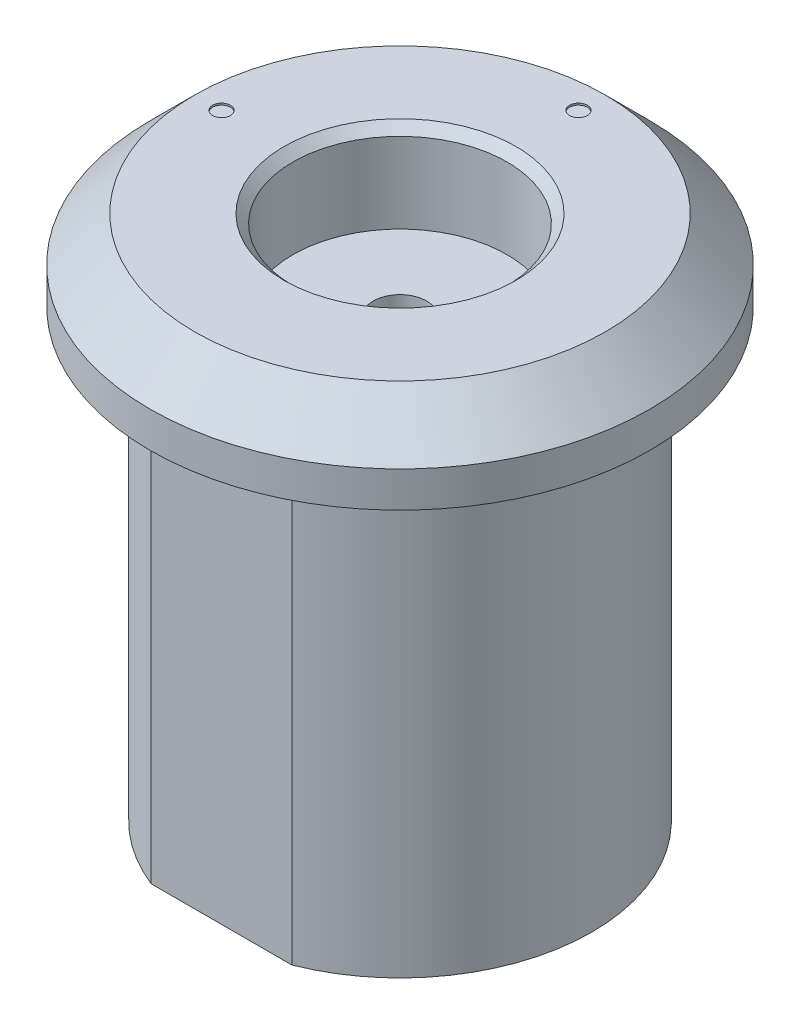
ISO-10303-21;
HEADER;
FILE_DESCRIPTION(('STEP AP214'),'2;1');
FILE_NAME('part.step','',(''),(''),'','','');
FILE_SCHEMA(('AUTOMOTIVE_DESIGN { 1 0 10303 214 1 1 1 1 }'));
ENDSEC;
DATA;
#1=APPLICATION_CONTEXT('core data for automotive mechanical design processes');
#2=APPLICATION_PROTOCOL_DEFINITION('international standard','automotive_design',2000,#1);
#3=PRODUCT_CONTEXT('',#1,'mechanical');
#4=PRODUCT('Part','Part','',(#3));
#5=PRODUCT_RELATED_PRODUCT_CATEGORY('part','',(#4));
#6=PRODUCT_DEFINITION_FORMATION('','',#4);
#7=PRODUCT_DEFINITION_CONTEXT('part definition',#1,'design');
#8=PRODUCT_DEFINITION('design','',#6,#7);
#9=PRODUCT_DEFINITION_SHAPE('','',#8);
#10=(LENGTH_UNIT() NAMED_UNIT(*) SI_UNIT(.MILLI.,.METRE.));
#11=(NAMED_UNIT(*) PLANE_ANGLE_UNIT() SI_UNIT($,.RADIAN.));
#12=(NAMED_UNIT(*) SI_UNIT($,.STERADIAN.) SOLID_ANGLE_UNIT());
#13=UNCERTAINTY_MEASURE_WITH_UNIT(LENGTH_MEASURE(1.E-05),#10,'distance_accuracy_value','');
#14=(GEOMETRIC_REPRESENTATION_CONTEXT(3) GLOBAL_UNCERTAINTY_ASSIGNED_CONTEXT((#13)) GLOBAL_UNIT_ASSIGNED_CONTEXT((#10,
#11,#12)) REPRESENTATION_CONTEXT('',''));
#15=CARTESIAN_POINT('',(0.,0.,0.));
#16=DIRECTION('',(0.,0.,1.));
#17=DIRECTION('',(1.,0.,0.));
#18=AXIS2_PLACEMENT_3D('',#15,#16,#17);
#19=CARTESIAN_POINT('',(0.,-25.,0.));
#20=DIRECTION('',(0.,1.,0.));
#21=DIRECTION('',(0.,0.,1.));
#22=AXIS2_PLACEMENT_3D('',#19,#20,#21);
#23=CYLINDRICAL_SURFACE('',#22,10.75);
#24=CARTESIAN_POINT('',(0.,-25.,0.));
#25=DIRECTION('',(0.,-1.,0.));
#26=DIRECTION('',(0.,0.,-1.));
#27=AXIS2_PLACEMENT_3D('',#24,#25,#26);
#28=CIRCLE('',#27,10.75);
#29=CARTESIAN_POINT('',(-3.94493345951487,-25.,10.));
#30=VERTEX_POINT('',#29);
#31=CARTESIAN_POINT('',(-3.94493345951487,-25.,-10.));
#32=VERTEX_POINT('',#31);
#33=EDGE_CURVE('E159',#30,#32,#28,.T.);
#34=ORIENTED_EDGE('',*,*,#33,.F.);
#35=DIRECTION('',(0.,-1.,0.));
#36=VECTOR('',#35,1.);
#37=CARTESIAN_POINT('',(-3.94493345951487,7.92543374207368,10.));
#38=LINE('',#37,#36);
#39=CARTESIAN_POINT('',(-3.94493345951487,0.,10.));
#40=VERTEX_POINT('',#39);
#41=EDGE_CURVE('E146',#40,#30,#38,.T.);
#42=ORIENTED_EDGE('',*,*,#41,.F.);
#43=CARTESIAN_POINT('',(0.,0.,0.));
#44=DIRECTION('',(0.,1.,0.));
#45=DIRECTION('',(0.,0.,1.));
#46=AXIS2_PLACEMENT_3D('',#43,#44,#45);
#47=CIRCLE('',#46,10.75);
#48=CARTESIAN_POINT('',(-3.94493345951487,0.,-10.));
#49=VERTEX_POINT('',#48);
#50=EDGE_CURVE('E184',#40,#49,#47,.F.);
#51=ORIENTED_EDGE('',*,*,#50,.T.);
#52=DIRECTION('',(0.,-1.,0.));
#53=VECTOR('',#52,1.);
#54=CARTESIAN_POINT('',(-3.94493345951487,7.92543374207368,-10.));
#55=LINE('',#54,#53);
#56=EDGE_CURVE('E154',#49,#32,#55,.T.);
#57=ORIENTED_EDGE('',*,*,#56,.T.);
#58=EDGE_LOOP('',(#34,#42,#51,#57));
#59=FACE_BOUND('',#58,.T.);
#60=ADVANCED_FACE('F37',(#59),#23,.T.);
#61=CARTESIAN_POINT('',(0.,4.5,0.));
#62=DIRECTION('',(0.,-1.,0.));
#63=DIRECTION('',(0.,0.,-1.));
#64=AXIS2_PLACEMENT_3D('',#61,#62,#63);
#65=CYLINDRICAL_SURFACE('',#64,14.);
#66=CARTESIAN_POINT('',(0.,1.99999999999999,0.));
#67=DIRECTION('',(0.,1.,0.));
#68=DIRECTION('',(0.,0.,1.));
#69=AXIS2_PLACEMENT_3D('',#66,#67,#68);
#70=CIRCLE('',#69,14.);
#71=CARTESIAN_POINT('',(0.,1.99999999999999,14.));
#72=VERTEX_POINT('',#71);
#73=EDGE_CURVE('E181',#72,#72,#70,.F.);
#74=ORIENTED_EDGE('',*,*,#73,.T.);
#75=EDGE_LOOP('',(#74));
#76=FACE_BOUND('',#75,.T.);
#77=CARTESIAN_POINT('',(0.,0.,0.));
#78=DIRECTION('',(0.,1.,0.));
#79=DIRECTION('',(0.,0.,1.));
#80=AXIS2_PLACEMENT_3D('',#77,#78,#79);
#81=CIRCLE('',#80,14.);
#82=CARTESIAN_POINT('',(0.,0.,14.));
#83=VERTEX_POINT('',#82);
#84=EDGE_CURVE('E173',#83,#83,#81,.T.);
#85=ORIENTED_EDGE('',*,*,#84,.T.);
#86=EDGE_LOOP('',(#85));
#87=FACE_BOUND('',#86,.T.);
#88=ADVANCED_FACE('F216',(#76,#87),#65,.T.);
#89=CARTESIAN_POINT('',(0.,4.5,0.));
#90=DIRECTION('',(0.,1.,0.));
#91=DIRECTION('',(0.,0.,1.));
#92=AXIS2_PLACEMENT_3D('',#89,#90,#91);
#93=PLANE('',#92);
#94=CARTESIAN_POINT('',(0.,4.5,0.));
#95=DIRECTION('',(0.,1.,0.));
#96=DIRECTION('',(0.,0.,1.));
#97=AXIS2_PLACEMENT_3D('',#94,#95,#96);
#98=CIRCLE('',#97,6.5);
#99=CARTESIAN_POINT('',(0.,4.5,6.5));
#100=VERTEX_POINT('',#99);
#101=EDGE_CURVE('E191',#100,#100,#98,.F.);
#102=ORIENTED_EDGE('',*,*,#101,.T.);
#103=EDGE_LOOP('',(#102));
#104=FACE_BOUND('',#103,.T.);
#105=CARTESIAN_POINT('',(0.,4.5,0.));
#106=DIRECTION('',(0.,1.,0.));
#107=DIRECTION('',(0.,0.,1.));
#108=AXIS2_PLACEMENT_3D('',#105,#106,#107);
#109=CIRCLE('',#108,11.5);
#110=CARTESIAN_POINT('',(0.,4.5,11.5));
#111=VERTEX_POINT('',#110);
#112=EDGE_CURVE('E178',#111,#111,#109,.T.);
#113=ORIENTED_EDGE('',*,*,#112,.T.);
#114=EDGE_LOOP('',(#113));
#115=FACE_BOUND('',#114,.T.);
#116=CARTESIAN_POINT('',(0.,4.5,-10.));
#117=DIRECTION('',(0.,1.,0.));
#118=DIRECTION('',(0.,0.,1.));
#119=AXIS2_PLACEMENT_3D('',#116,#117,#118);
#120=CIRCLE('',#119,0.500000000000001);
#121=CARTESIAN_POINT('',(0.,4.5,-9.5));
#122=VERTEX_POINT('',#121);
#123=EDGE_CURVE('E163',#122,#122,#120,.T.);
#124=ORIENTED_EDGE('',*,*,#123,.F.);
#125=EDGE_LOOP('',(#124));
#126=FACE_BOUND('',#125,.T.);
#127=CARTESIAN_POINT('',(-10.,4.5,0.));
#128=DIRECTION('',(0.,1.,0.));
#129=DIRECTION('',(0.,0.,1.));
#130=AXIS2_PLACEMENT_3D('',#127,#128,#129);
#131=CIRCLE('',#130,0.500000000000001);
#132=CARTESIAN_POINT('',(-10.,4.5,0.500000000000001));
#133=VERTEX_POINT('',#132);
#134=EDGE_CURVE('E167',#133,#133,#131,.T.);
#135=ORIENTED_EDGE('',*,*,#134,.F.);
#136=EDGE_LOOP('',(#135));
#137=FACE_BOUND('',#136,.T.);
#138=ADVANCED_FACE('F223',(#104,#115,#126,#137),#93,.T.);
#139=CARTESIAN_POINT('',(0.,0.,0.));
#140=DIRECTION('',(0.,1.,0.));
#141=DIRECTION('',(0.,0.,1.));
#142=AXIS2_PLACEMENT_3D('',#139,#140,#141);
#143=PLANE('',#142);
#144=CARTESIAN_POINT('',(3.94493345951487,0.,-10.));
#145=VERTEX_POINT('',#144);
#146=CARTESIAN_POINT('',(3.94493345951487,0.,10.));
#147=VERTEX_POINT('',#146);
#148=EDGE_CURVE('E185',#145,#147,#47,.F.);
#149=ORIENTED_EDGE('',*,*,#148,.F.);
#150=DIRECTION('',(-1.,0.,0.));
#151=VECTOR('',#150,1.);
#152=CARTESIAN_POINT('',(-3.94493345951487,0.,-10.));
#153=LINE('',#152,#151);
#154=EDGE_CURVE('E151',#145,#49,#153,.T.);
#155=ORIENTED_EDGE('',*,*,#154,.T.);
#156=ORIENTED_EDGE('',*,*,#50,.F.);
#157=DIRECTION('',(1.,0.,0.));
#158=VECTOR('',#157,1.);
#159=CARTESIAN_POINT('',(-3.94493345951487,0.,10.));
#160=LINE('',#159,#158);
#161=EDGE_CURVE('E140',#40,#147,#160,.T.);
#162=ORIENTED_EDGE('',*,*,#161,.T.);
#163=EDGE_LOOP('',(#149,#155,#156,#162));
#164=FACE_BOUND('',#163,.T.);
#165=ORIENTED_EDGE('',*,*,#84,.F.);
#166=EDGE_LOOP('',(#165));
#167=FACE_BOUND('',#166,.T.);
#168=ADVANCED_FACE('F245',(#164,#167),#143,.F.);
#169=CARTESIAN_POINT('',(-10.,4.4,0.));
#170=DIRECTION('',(0.,1.,0.));
#171=DIRECTION('',(0.,0.,1.));
#172=AXIS2_PLACEMENT_3D('',#169,#170,#171);
#173=CYLINDRICAL_SURFACE('',#172,0.500000000000001);
#174=CARTESIAN_POINT('',(-10.,4.4,0.));
#175=DIRECTION('',(0.,1.,0.));
#176=DIRECTION('',(0.,0.,1.));
#177=AXIS2_PLACEMENT_3D('',#174,#175,#176);
#178=CIRCLE('',#177,0.500000000000001);
#179=CARTESIAN_POINT('',(-10.,4.4,0.500000000000001));
#180=VERTEX_POINT('',#179);
#181=EDGE_CURVE('E170',#180,#180,#178,.T.);
#182=ORIENTED_EDGE('',*,*,#181,.F.);
#183=EDGE_LOOP('',(#182));
#184=FACE_BOUND('',#183,.T.);
#185=ORIENTED_EDGE('',*,*,#134,.T.);
#186=EDGE_LOOP('',(#185));
#187=FACE_BOUND('',#186,.T.);
#188=ADVANCED_FACE('F295',(#184,#187),#173,.F.);
#189=CARTESIAN_POINT('',(-10.,4.4,0.));
#190=DIRECTION('',(0.,1.,0.));
#191=DIRECTION('',(0.,0.,1.));
#192=AXIS2_PLACEMENT_3D('',#189,#190,#191);
#193=PLANE('',#192);
#194=ORIENTED_EDGE('',*,*,#181,.T.);
#195=EDGE_LOOP('',(#194));
#196=FACE_BOUND('',#195,.T.);
#197=ADVANCED_FACE('F297',(#196),#193,.T.);
#198=CARTESIAN_POINT('',(0.,4.4,-10.));
#199=DIRECTION('',(0.,1.,0.));
#200=DIRECTION('',(0.,0.,1.));
#201=AXIS2_PLACEMENT_3D('',#198,#199,#200);
#202=CYLINDRICAL_SURFACE('',#201,0.500000000000001);
#203=CARTESIAN_POINT('',(0.,4.4,-10.));
#204=DIRECTION('',(0.,1.,0.));
#205=DIRECTION('',(0.,0.,1.));
#206=AXIS2_PLACEMENT_3D('',#203,#204,#205);
#207=CIRCLE('',#206,0.500000000000001);
#208=CARTESIAN_POINT('',(0.,4.4,-9.5));
#209=VERTEX_POINT('',#208);
#210=EDGE_CURVE('E164',#209,#209,#207,.T.);
#211=ORIENTED_EDGE('',*,*,#210,.F.);
#212=EDGE_LOOP('',(#211));
#213=FACE_BOUND('',#212,.T.);
#214=ORIENTED_EDGE('',*,*,#123,.T.);
#215=EDGE_LOOP('',(#214));
#216=FACE_BOUND('',#215,.T.);
#217=ADVANCED_FACE('F304',(#213,#216),#202,.F.);
#218=CARTESIAN_POINT('',(0.,4.4,-10.));
#219=DIRECTION('',(0.,1.,0.));
#220=DIRECTION('',(0.,0.,1.));
#221=AXIS2_PLACEMENT_3D('',#218,#219,#220);
#222=PLANE('',#221);
#223=ORIENTED_EDGE('',*,*,#210,.T.);
#224=EDGE_LOOP('',(#223));
#225=FACE_BOUND('',#224,.T.);
#226=ADVANCED_FACE('F239',(#225),#222,.T.);
#227=CARTESIAN_POINT('',(0.,4.5,0.));
#228=DIRECTION('',(0.,-1.,0.));
#229=DIRECTION('',(0.,0.,-1.));
#230=AXIS2_PLACEMENT_3D('',#227,#228,#229);
#231=CONICAL_SURFACE('',#230,11.5,0.785398163397446);
#232=ORIENTED_EDGE('',*,*,#73,.F.);
#233=EDGE_LOOP('',(#232));
#234=FACE_BOUND('',#233,.T.);
#235=ORIENTED_EDGE('',*,*,#112,.F.);
#236=EDGE_LOOP('',(#235));
#237=FACE_BOUND('',#236,.T.);
#238=ADVANCED_FACE('F231',(#234,#237),#231,.T.);
#239=ORIENTED_EDGE('',*,*,#148,.T.);
#240=DIRECTION('',(0.,-1.,0.));
#241=VECTOR('',#240,1.);
#242=CARTESIAN_POINT('',(3.94493345951487,7.92543374207368,10.));
#243=LINE('',#242,#241);
#244=CARTESIAN_POINT('',(3.94493345951487,-25.,10.));
#245=VERTEX_POINT('',#244);
#246=EDGE_CURVE('E143',#147,#245,#243,.T.);
#247=ORIENTED_EDGE('',*,*,#246,.T.);
#248=CARTESIAN_POINT('',(3.94493345951487,-25.,-10.));
#249=VERTEX_POINT('',#248);
#250=EDGE_CURVE('E160',#249,#245,#28,.T.);
#251=ORIENTED_EDGE('',*,*,#250,.F.);
#252=DIRECTION('',(0.,-1.,0.));
#253=VECTOR('',#252,1.);
#254=CARTESIAN_POINT('',(3.94493345951487,7.92543374207368,-10.));
#255=LINE('',#254,#253);
#256=EDGE_CURVE('E157',#145,#249,#255,.T.);
#257=ORIENTED_EDGE('',*,*,#256,.F.);
#258=EDGE_LOOP('',(#239,#247,#251,#257));
#259=FACE_BOUND('',#258,.T.);
#260=ADVANCED_FACE('F219',(#259),#23,.T.);
#261=CARTESIAN_POINT('',(0.,-25.,0.));
#262=DIRECTION('',(0.,-1.,0.));
#263=DIRECTION('',(0.,0.,-1.));
#264=AXIS2_PLACEMENT_3D('',#261,#262,#263);
#265=PLANE('',#264);
#266=CARTESIAN_POINT('',(0.,-25.,0.));
#267=DIRECTION('',(0.,-1.,0.));
#268=DIRECTION('',(0.,0.,-1.));
#269=AXIS2_PLACEMENT_3D('',#266,#267,#268);
#270=CIRCLE('',#269,8.);
#271=CARTESIAN_POINT('',(0.,-25.,-8.));
#272=VERTEX_POINT('',#271);
#273=EDGE_CURVE('E127',#272,#272,#270,.T.);
#274=ORIENTED_EDGE('',*,*,#273,.F.);
#275=EDGE_LOOP('',(#274));
#276=FACE_BOUND('',#275,.T.);
#277=DIRECTION('',(1.,0.,0.));
#278=VECTOR('',#277,1.);
#279=CARTESIAN_POINT('',(-3.94493345951487,-25.,10.));
#280=LINE('',#279,#278);
#281=EDGE_CURVE('E138',#30,#245,#280,.T.);
#282=ORIENTED_EDGE('',*,*,#281,.F.);
#283=ORIENTED_EDGE('',*,*,#33,.T.);
#284=DIRECTION('',(-1.,0.,0.));
#285=VECTOR('',#284,1.);
#286=CARTESIAN_POINT('',(-3.94493345951487,-25.,-10.));
#287=LINE('',#286,#285);
#288=EDGE_CURVE('E148',#249,#32,#287,.T.);
#289=ORIENTED_EDGE('',*,*,#288,.F.);
#290=ORIENTED_EDGE('',*,*,#250,.T.);
#291=EDGE_LOOP('',(#282,#283,#289,#290));
#292=FACE_BOUND('',#291,.T.);
#293=ADVANCED_FACE('F230',(#276,#292),#265,.T.);
#294=CARTESIAN_POINT('',(-3.94493345951487,7.92543374207368,-10.));
#295=DIRECTION('',(0.,0.,1.));
#296=DIRECTION('',(1.,0.,0.));
#297=AXIS2_PLACEMENT_3D('',#294,#295,#296);
#298=PLANE('',#297);
#299=ORIENTED_EDGE('',*,*,#256,.T.);
#300=ORIENTED_EDGE('',*,*,#288,.T.);
#301=ORIENTED_EDGE('',*,*,#56,.F.);
#302=ORIENTED_EDGE('',*,*,#154,.F.);
#303=EDGE_LOOP('',(#299,#300,#301,#302));
#304=FACE_BOUND('',#303,.T.);
#305=ADVANCED_FACE('F237',(#304),#298,.F.);
#306=CARTESIAN_POINT('',(-3.94493345951487,7.92543374207368,10.));
#307=DIRECTION('',(0.,0.,-1.));
#308=DIRECTION('',(-1.,0.,0.));
#309=AXIS2_PLACEMENT_3D('',#306,#307,#308);
#310=PLANE('',#309);
#311=ORIENTED_EDGE('',*,*,#41,.T.);
#312=ORIENTED_EDGE('',*,*,#281,.T.);
#313=ORIENTED_EDGE('',*,*,#246,.F.);
#314=ORIENTED_EDGE('',*,*,#161,.F.);
#315=EDGE_LOOP('',(#311,#312,#313,#314));
#316=FACE_BOUND('',#315,.T.);
#317=ADVANCED_FACE('F250',(#316),#310,.F.);
#318=CARTESIAN_POINT('',(0.,-0.5,0.));
#319=DIRECTION('',(0.,1.,0.));
#320=DIRECTION('',(0.,0.,1.));
#321=AXIS2_PLACEMENT_3D('',#318,#319,#320);
#322=CYLINDRICAL_SURFACE('',#321,6.);
#323=CARTESIAN_POINT('',(0.,4.00000000000001,0.));
#324=DIRECTION('',(0.,1.,0.));
#325=DIRECTION('',(0.,0.,1.));
#326=AXIS2_PLACEMENT_3D('',#323,#324,#325);
#327=CIRCLE('',#326,6.);
#328=CARTESIAN_POINT('',(0.,4.00000000000001,6.));
#329=VERTEX_POINT('',#328);
#330=EDGE_CURVE('E188',#329,#329,#327,.T.);
#331=ORIENTED_EDGE('',*,*,#330,.T.);
#332=EDGE_LOOP('',(#331));
#333=FACE_BOUND('',#332,.T.);
#334=CARTESIAN_POINT('',(0.,-0.5,0.));
#335=DIRECTION('',(0.,1.,0.));
#336=DIRECTION('',(0.,0.,1.));
#337=AXIS2_PLACEMENT_3D('',#334,#335,#336);
#338=CIRCLE('',#337,6.);
#339=CARTESIAN_POINT('',(0.,-0.5,6.));
#340=VERTEX_POINT('',#339);
#341=EDGE_CURVE('E133',#340,#340,#338,.T.);
#342=ORIENTED_EDGE('',*,*,#341,.F.);
#343=EDGE_LOOP('',(#342));
#344=FACE_BOUND('',#343,.T.);
#345=ADVANCED_FACE('F261',(#333,#344),#322,.F.);
#346=CARTESIAN_POINT('',(0.,-0.5,0.));
#347=DIRECTION('',(0.,1.,0.));
#348=DIRECTION('',(0.,0.,1.));
#349=AXIS2_PLACEMENT_3D('',#346,#347,#348);
#350=PLANE('',#349);
#351=DIRECTION('',(1.,0.,0.));
#352=VECTOR('',#351,1.);
#353=CARTESIAN_POINT('',(0.5,-0.5,2.));
#354=LINE('',#353,#352);
#355=CARTESIAN_POINT('',(-0.5,-0.5,2.));
#356=VERTEX_POINT('',#355);
#357=CARTESIAN_POINT('',(0.5,-0.5,2.));
#358=VERTEX_POINT('',#357);
#359=EDGE_CURVE('E52',#356,#358,#354,.T.);
#360=ORIENTED_EDGE('',*,*,#359,.F.);
#361=DIRECTION('',(0.,0.,1.));
#362=VECTOR('',#361,1.);
#363=CARTESIAN_POINT('',(-0.5,-0.5,2.));
#364=LINE('',#363,#362);
#365=CARTESIAN_POINT('',(-0.5,-0.5,1.4142135623731));
#366=VERTEX_POINT('',#365);
#367=EDGE_CURVE('E120',#366,#356,#364,.T.);
#368=ORIENTED_EDGE('',*,*,#367,.F.);
#369=CARTESIAN_POINT('',(0.,-0.5,0.));
#370=DIRECTION('',(0.,1.,0.));
#371=DIRECTION('',(0.,0.,1.));
#372=AXIS2_PLACEMENT_3D('',#369,#370,#371);
#373=CIRCLE('',#372,1.5);
#374=CARTESIAN_POINT('',(0.5,-0.5,1.4142135623731));
#375=VERTEX_POINT('',#374);
#376=EDGE_CURVE('E104',#375,#366,#373,.T.);
#377=ORIENTED_EDGE('',*,*,#376,.F.);
#378=DIRECTION('',(0.,0.,-1.));
#379=VECTOR('',#378,1.);
#380=CARTESIAN_POINT('',(0.5,-0.5,2.));
#381=LINE('',#380,#379);
#382=EDGE_CURVE('E113',#358,#375,#381,.T.);
#383=ORIENTED_EDGE('',*,*,#382,.F.);
#384=EDGE_LOOP('',(#360,#368,#377,#383));
#385=FACE_BOUND('',#384,.T.);
#386=ORIENTED_EDGE('',*,*,#341,.T.);
#387=EDGE_LOOP('',(#386));
#388=FACE_BOUND('',#387,.T.);
#389=ADVANCED_FACE('F117',(#385,#388),#350,.T.);
#390=CARTESIAN_POINT('',(0.,4.00000000000001,0.));
#391=DIRECTION('',(0.,1.,0.));
#392=DIRECTION('',(0.,0.,1.));
#393=AXIS2_PLACEMENT_3D('',#390,#391,#392);
#394=CONICAL_SURFACE('',#393,6.,0.785398163397455);
#395=ORIENTED_EDGE('',*,*,#101,.F.);
#396=EDGE_LOOP('',(#395));
#397=FACE_BOUND('',#396,.T.);
#398=ORIENTED_EDGE('',*,*,#330,.F.);
#399=EDGE_LOOP('',(#398));
#400=FACE_BOUND('',#399,.T.);
#401=ADVANCED_FACE('F39',(#397,#400),#394,.F.);
#402=CARTESIAN_POINT('',(0.,-5.,0.));
#403=DIRECTION('',(0.,-1.,0.));
#404=DIRECTION('',(0.,0.,-1.));
#405=AXIS2_PLACEMENT_3D('',#402,#403,#404);
#406=CYLINDRICAL_SURFACE('',#405,8.);
#407=CARTESIAN_POINT('',(0.,-5.,0.));
#408=DIRECTION('',(0.,-1.,0.));
#409=DIRECTION('',(0.,0.,-1.));
#410=AXIS2_PLACEMENT_3D('',#407,#408,#409);
#411=CIRCLE('',#410,8.);
#412=CARTESIAN_POINT('',(0.,-5.,-8.));
#413=VERTEX_POINT('',#412);
#414=EDGE_CURVE('E130',#413,#413,#411,.T.);
#415=ORIENTED_EDGE('',*,*,#414,.F.);
#416=EDGE_LOOP('',(#415));
#417=FACE_BOUND('',#416,.T.);
#418=ORIENTED_EDGE('',*,*,#273,.T.);
#419=EDGE_LOOP('',(#418));
#420=FACE_BOUND('',#419,.T.);
#421=ADVANCED_FACE('F212',(#417,#420),#406,.F.);
#422=CARTESIAN_POINT('',(0.,-5.,0.));
#423=DIRECTION('',(0.,-1.,0.));
#424=DIRECTION('',(0.,0.,-1.));
#425=AXIS2_PLACEMENT_3D('',#422,#423,#424);
#426=PLANE('',#425);
#427=DIRECTION('',(-1.,0.,0.));
#428=VECTOR('',#427,1.);
#429=CARTESIAN_POINT('',(0.,-5.,2.));
#430=LINE('',#429,#428);
#431=CARTESIAN_POINT('',(0.5,-5.,2.));
#432=VERTEX_POINT('',#431);
#433=CARTESIAN_POINT('',(-0.5,-5.,2.));
#434=VERTEX_POINT('',#433);
#435=EDGE_CURVE('E11',#432,#434,#430,.T.);
#436=ORIENTED_EDGE('',*,*,#435,.F.);
#437=DIRECTION('',(0.,0.,1.));
#438=VECTOR('',#437,1.);
#439=CARTESIAN_POINT('',(0.499999999999999,-5.,0.));
#440=LINE('',#439,#438);
#441=CARTESIAN_POINT('',(0.5,-5.,1.4142135623731));
#442=VERTEX_POINT('',#441);
#443=EDGE_CURVE('E194',#442,#432,#440,.T.);
#444=ORIENTED_EDGE('',*,*,#443,.F.);
#445=CARTESIAN_POINT('',(0.,-5.,0.));
#446=DIRECTION('',(0.,-1.,0.));
#447=DIRECTION('',(0.,0.,-1.));
#448=AXIS2_PLACEMENT_3D('',#445,#446,#447);
#449=CIRCLE('',#448,1.5);
#450=CARTESIAN_POINT('',(-0.5,-5.,1.4142135623731));
#451=VERTEX_POINT('',#450);
#452=EDGE_CURVE('E107',#451,#442,#449,.T.);
#453=ORIENTED_EDGE('',*,*,#452,.F.);
#454=DIRECTION('',(0.,0.,-1.));
#455=VECTOR('',#454,1.);
#456=CARTESIAN_POINT('',(-0.499999999999999,-5.,0.));
#457=LINE('',#456,#455);
#458=EDGE_CURVE('E45',#434,#451,#457,.T.);
#459=ORIENTED_EDGE('',*,*,#458,.F.);
#460=EDGE_LOOP('',(#436,#444,#453,#459));
#461=FACE_BOUND('',#460,.T.);
#462=ORIENTED_EDGE('',*,*,#414,.T.);
#463=EDGE_LOOP('',(#462));
#464=FACE_BOUND('',#463,.T.);
#465=ADVANCED_FACE('F202',(#461,#464),#426,.T.);
#466=CARTESIAN_POINT('',(0.5,-25.,2.));
#467=DIRECTION('',(0.,0.,1.));
#468=DIRECTION('',(1.,0.,0.));
#469=AXIS2_PLACEMENT_3D('',#466,#467,#468);
#470=PLANE('',#469);
#471=ORIENTED_EDGE('',*,*,#435,.T.);
#472=DIRECTION('',(0.,1.,0.));
#473=VECTOR('',#472,1.);
#474=CARTESIAN_POINT('',(-0.5,-25.,2.));
#475=LINE('',#474,#473);
#476=EDGE_CURVE('E125',#434,#356,#475,.T.);
#477=ORIENTED_EDGE('',*,*,#476,.T.);
#478=ORIENTED_EDGE('',*,*,#359,.T.);
#479=DIRECTION('',(0.,1.,0.));
#480=VECTOR('',#479,1.);
#481=CARTESIAN_POINT('',(0.5,-25.,2.));
#482=LINE('',#481,#480);
#483=EDGE_CURVE('E110',#432,#358,#482,.T.);
#484=ORIENTED_EDGE('',*,*,#483,.F.);
#485=EDGE_LOOP('',(#471,#477,#478,#484));
#486=FACE_BOUND('',#485,.T.);
#487=ADVANCED_FACE('F204',(#486),#470,.F.);
#488=CARTESIAN_POINT('',(-0.5,-25.,2.));
#489=DIRECTION('',(-1.,0.,0.));
#490=DIRECTION('',(0.,0.,1.));
#491=AXIS2_PLACEMENT_3D('',#488,#489,#490);
#492=PLANE('',#491);
#493=ORIENTED_EDGE('',*,*,#458,.T.);
#494=DIRECTION('',(0.,1.,0.));
#495=VECTOR('',#494,1.);
#496=CARTESIAN_POINT('',(-0.5,-25.,1.4142135623731));
#497=LINE('',#496,#495);
#498=EDGE_CURVE('E109',#451,#366,#497,.T.);
#499=ORIENTED_EDGE('',*,*,#498,.T.);
#500=ORIENTED_EDGE('',*,*,#367,.T.);
#501=ORIENTED_EDGE('',*,*,#476,.F.);
#502=EDGE_LOOP('',(#493,#499,#500,#501));
#503=FACE_BOUND('',#502,.T.);
#504=ADVANCED_FACE('F199',(#503),#492,.F.);
#505=CARTESIAN_POINT('',(0.,-25.,0.));
#506=DIRECTION('',(0.,1.,0.));
#507=DIRECTION('',(0.,0.,1.));
#508=AXIS2_PLACEMENT_3D('',#505,#506,#507);
#509=CYLINDRICAL_SURFACE('',#508,1.5);
#510=ORIENTED_EDGE('',*,*,#452,.T.);
#511=DIRECTION('',(0.,1.,0.));
#512=VECTOR('',#511,1.);
#513=CARTESIAN_POINT('',(0.5,-25.,1.4142135623731));
#514=LINE('',#513,#512);
#515=EDGE_CURVE('E60',#442,#375,#514,.T.);
#516=ORIENTED_EDGE('',*,*,#515,.T.);
#517=ORIENTED_EDGE('',*,*,#376,.T.);
#518=ORIENTED_EDGE('',*,*,#498,.F.);
#519=EDGE_LOOP('',(#510,#516,#517,#518));
#520=FACE_BOUND('',#519,.T.);
#521=ADVANCED_FACE('F101',(#520),#509,.F.);
#522=CARTESIAN_POINT('',(0.5,-25.,2.));
#523=DIRECTION('',(1.,0.,0.));
#524=DIRECTION('',(0.,0.,-1.));
#525=AXIS2_PLACEMENT_3D('',#522,#523,#524);
#526=PLANE('',#525);
#527=ORIENTED_EDGE('',*,*,#443,.T.);
#528=ORIENTED_EDGE('',*,*,#483,.T.);
#529=ORIENTED_EDGE('',*,*,#382,.T.);
#530=ORIENTED_EDGE('',*,*,#515,.F.);
#531=EDGE_LOOP('',(#527,#528,#529,#530));
#532=FACE_BOUND('',#531,.T.);
#533=ADVANCED_FACE('F114',(#532),#526,.F.);
#534=CLOSED_SHELL('',(#60,#88,#138,#168,#188,#197,#217,#226,#238,#260,#293,#305,#317,#345,#389,
#401,#421,#465,#487,#504,#521,#533));
#535=MANIFOLD_SOLID_BREP('B2',#534);
#536=ADVANCED_BREP_SHAPE_REPRESENTATION('',(#18,#535),#14);
#537=SHAPE_DEFINITION_REPRESENTATION(#9,#536);
ENDSEC;
END-ISO-10303-21;
